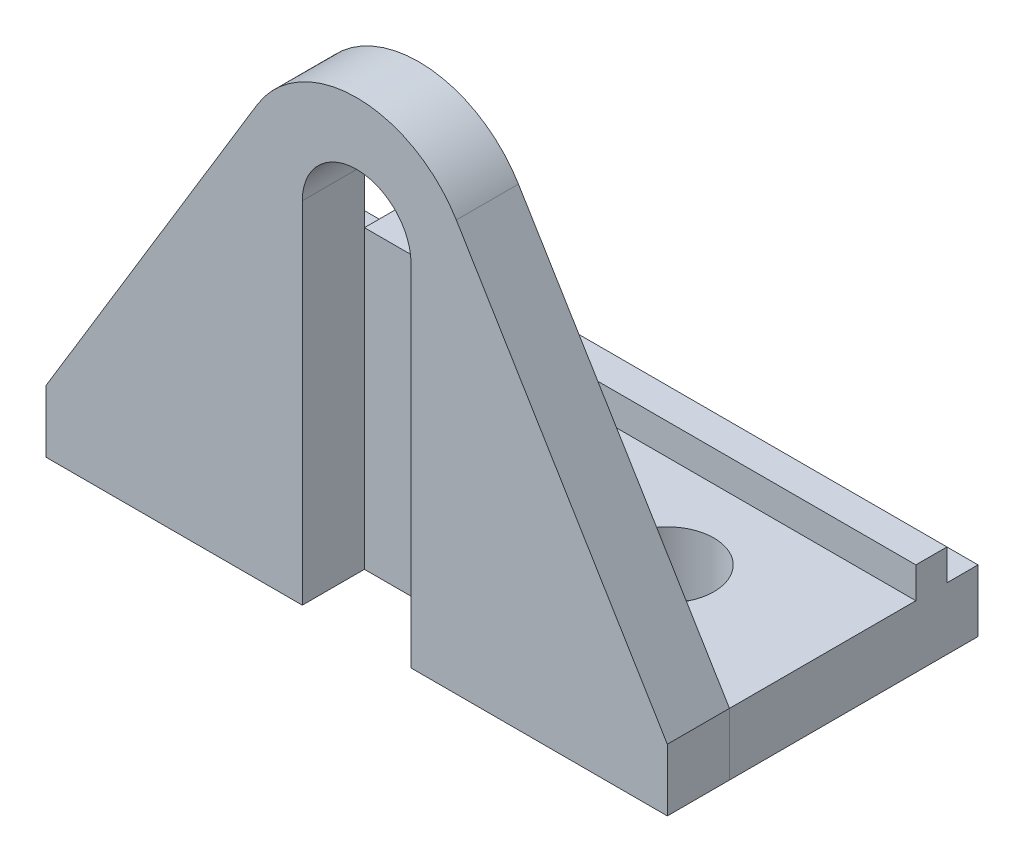
ISO-10303-21;
HEADER;
FILE_DESCRIPTION(('STEP AP214'),'2;1');
FILE_NAME('part.step','',(''),(''),'','','');
FILE_SCHEMA(('AUTOMOTIVE_DESIGN { 1 0 10303 214 1 1 1 1 }'));
ENDSEC;
DATA;
#1=APPLICATION_CONTEXT('core data for automotive mechanical design processes');
#2=APPLICATION_PROTOCOL_DEFINITION('international standard','automotive_design',2000,#1);
#3=PRODUCT_CONTEXT('',#1,'mechanical');
#4=PRODUCT('Part','Part','',(#3));
#5=PRODUCT_RELATED_PRODUCT_CATEGORY('part','',(#4));
#6=PRODUCT_DEFINITION_FORMATION('','',#4);
#7=PRODUCT_DEFINITION_CONTEXT('part definition',#1,'design');
#8=PRODUCT_DEFINITION('design','',#6,#7);
#9=PRODUCT_DEFINITION_SHAPE('','',#8);
#10=(LENGTH_UNIT() NAMED_UNIT(*) SI_UNIT(.MILLI.,.METRE.));
#11=(NAMED_UNIT(*) PLANE_ANGLE_UNIT() SI_UNIT($,.RADIAN.));
#12=(NAMED_UNIT(*) SI_UNIT($,.STERADIAN.) SOLID_ANGLE_UNIT());
#13=UNCERTAINTY_MEASURE_WITH_UNIT(LENGTH_MEASURE(1.E-05),#10,'distance_accuracy_value','');
#14=(GEOMETRIC_REPRESENTATION_CONTEXT(3) GLOBAL_UNCERTAINTY_ASSIGNED_CONTEXT((#13)) GLOBAL_UNIT_ASSIGNED_CONTEXT((#10,
#11,#12)) REPRESENTATION_CONTEXT('',''));
#15=CARTESIAN_POINT('',(0.,0.,0.));
#16=DIRECTION('',(0.,0.,1.));
#17=DIRECTION('',(1.,0.,0.));
#18=AXIS2_PLACEMENT_3D('',#15,#16,#17);
#19=CARTESIAN_POINT('',(2.47320292132228,0.999999999999996,-2.));
#20=DIRECTION('',(0.,-1.,0.));
#21=DIRECTION('',(1.,0.,0.));
#22=AXIS2_PLACEMENT_3D('',#19,#20,#21);
#23=PLANE('',#22);
#24=CARTESIAN_POINT('',(-4.27679707867771,0.999999999999995,-3.));
#25=DIRECTION('',(0.,1.,0.));
#26=DIRECTION('',(0.,0.,1.));
#27=AXIS2_PLACEMENT_3D('',#24,#25,#26);
#28=CIRCLE('',#27,1.5);
#29=CARTESIAN_POINT('',(-4.27679707867771,0.999999999999995,-1.5));
#30=VERTEX_POINT('',#29);
#31=EDGE_CURVE('E308',#30,#30,#28,.T.);
#32=ORIENTED_EDGE('',*,*,#31,.F.);
#33=EDGE_LOOP('',(#32));
#34=FACE_BOUND('',#33,.T.);
#35=CARTESIAN_POINT('',(5.72320292132229,0.999999999999995,-3.));
#36=DIRECTION('',(0.,1.,0.));
#37=DIRECTION('',(0.,0.,1.));
#38=AXIS2_PLACEMENT_3D('',#35,#36,#37);
#39=CIRCLE('',#38,1.5);
#40=CARTESIAN_POINT('',(5.72320292132229,0.999999999999995,-1.5));
#41=VERTEX_POINT('',#40);
#42=EDGE_CURVE('E302',#41,#41,#39,.T.);
#43=ORIENTED_EDGE('',*,*,#42,.F.);
#44=EDGE_LOOP('',(#43));
#45=FACE_BOUND('',#44,.T.);
#46=DIRECTION('',(1.,0.,0.));
#47=VECTOR('',#46,1.);
#48=CARTESIAN_POINT('',(-9.27679707867771,0.999999999999995,-6.));
#49=LINE('',#48,#47);
#50=CARTESIAN_POINT('',(-9.27679707867771,0.999999999999997,-6.));
#51=VERTEX_POINT('',#50);
#52=CARTESIAN_POINT('',(10.7232029213223,1.,-6.));
#53=VERTEX_POINT('',#52);
#54=EDGE_CURVE('E63',#51,#53,#49,.T.);
#55=ORIENTED_EDGE('',*,*,#54,.F.);
#56=DIRECTION('',(0.,0.,1.));
#57=VECTOR('',#56,1.);
#58=CARTESIAN_POINT('',(-9.27679707867771,0.999999999999997,-2.));
#59=LINE('',#58,#57);
#60=CARTESIAN_POINT('',(-9.27679707867771,0.999999999999997,0.));
#61=VERTEX_POINT('',#60);
#62=EDGE_CURVE('E158',#51,#61,#59,.T.);
#63=ORIENTED_EDGE('',*,*,#62,.T.);
#64=DIRECTION('',(1.,0.,0.));
#65=VECTOR('',#64,1.);
#66=CARTESIAN_POINT('',(-9.27679707867771,0.999999999999997,0.));
#67=LINE('',#66,#65);
#68=CARTESIAN_POINT('',(-1.02679707867772,0.999999999999996,0.));
#69=VERTEX_POINT('',#68);
#70=EDGE_CURVE('E187',#61,#69,#67,.T.);
#71=ORIENTED_EDGE('',*,*,#70,.T.);
#72=DIRECTION('',(0.,0.,1.));
#73=VECTOR('',#72,1.);
#74=CARTESIAN_POINT('',(-1.02679707867772,0.999999999999996,-2.));
#75=LINE('',#74,#73);
#76=CARTESIAN_POINT('',(-1.02679707867772,0.999999999999996,-2.));
#77=VERTEX_POINT('',#76);
#78=EDGE_CURVE('E207',#77,#69,#75,.T.);
#79=ORIENTED_EDGE('',*,*,#78,.F.);
#80=DIRECTION('',(1.,0.,0.));
#81=VECTOR('',#80,1.);
#82=CARTESIAN_POINT('',(10.7232029213223,1.,-2.));
#83=LINE('',#82,#81);
#84=CARTESIAN_POINT('',(2.47320292132228,0.999999999999996,-2.));
#85=VERTEX_POINT('',#84);
#86=EDGE_CURVE('E12',#77,#85,#83,.T.);
#87=ORIENTED_EDGE('',*,*,#86,.T.);
#88=DIRECTION('',(0.,0.,1.));
#89=VECTOR('',#88,1.);
#90=CARTESIAN_POINT('',(2.47320292132228,0.999999999999996,-2.));
#91=LINE('',#90,#89);
#92=CARTESIAN_POINT('',(2.47320292132228,0.999999999999996,0.));
#93=VERTEX_POINT('',#92);
#94=EDGE_CURVE('E200',#85,#93,#91,.T.);
#95=ORIENTED_EDGE('',*,*,#94,.T.);
#96=DIRECTION('',(1.,0.,0.));
#97=VECTOR('',#96,1.);
#98=CARTESIAN_POINT('',(2.47320292132228,0.999999999999996,0.));
#99=LINE('',#98,#97);
#100=CARTESIAN_POINT('',(10.7232029213223,1.,0.));
#101=VERTEX_POINT('',#100);
#102=EDGE_CURVE('E195',#93,#101,#99,.T.);
#103=ORIENTED_EDGE('',*,*,#102,.T.);
#104=DIRECTION('',(0.,0.,1.));
#105=VECTOR('',#104,1.);
#106=CARTESIAN_POINT('',(10.7232029213223,1.,-2.));
#107=LINE('',#106,#105);
#108=EDGE_CURVE('E68',#53,#101,#107,.T.);
#109=ORIENTED_EDGE('',*,*,#108,.F.);
#110=EDGE_LOOP('',(#55,#63,#71,#79,#87,#95,#103,#109));
#111=FACE_BOUND('',#110,.T.);
#112=ADVANCED_FACE('F46',(#34,#45,#111),#23,.F.);
#113=DIRECTION('',(-1.,0.,0.));
#114=VECTOR('',#113,1.);
#115=CARTESIAN_POINT('',(-9.27679707867771,0.999999999999995,-7.));
#116=LINE('',#115,#114);
#117=CARTESIAN_POINT('',(10.7232029213223,1.,-7.));
#118=VERTEX_POINT('',#117);
#119=CARTESIAN_POINT('',(-9.27679707867771,0.999999999999995,-7.));
#120=VERTEX_POINT('',#119);
#121=EDGE_CURVE('E154',#118,#120,#116,.T.);
#122=ORIENTED_EDGE('',*,*,#121,.F.);
#123=CARTESIAN_POINT('',(10.7232029213223,1.,-8.));
#124=VERTEX_POINT('',#123);
#125=EDGE_CURVE('E197',#124,#118,#107,.T.);
#126=ORIENTED_EDGE('',*,*,#125,.F.);
#127=DIRECTION('',(1.,0.,0.));
#128=VECTOR('',#127,1.);
#129=CARTESIAN_POINT('',(10.7232029213223,1.,-8.));
#130=LINE('',#129,#128);
#131=CARTESIAN_POINT('',(-9.27679707867771,1.,-8.));
#132=VERTEX_POINT('',#131);
#133=EDGE_CURVE('E173',#132,#124,#130,.T.);
#134=ORIENTED_EDGE('',*,*,#133,.F.);
#135=EDGE_CURVE('E208',#132,#120,#59,.T.);
#136=ORIENTED_EDGE('',*,*,#135,.T.);
#137=EDGE_LOOP('',(#122,#126,#134,#136));
#138=FACE_BOUND('',#137,.T.);
#139=ADVANCED_FACE('F271',(#138),#23,.F.);
#140=CARTESIAN_POINT('',(10.7232029213223,1.,-2.));
#141=DIRECTION('',(-1.,0.,0.));
#142=DIRECTION('',(0.,0.,1.));
#143=AXIS2_PLACEMENT_3D('',#140,#141,#142);
#144=PLANE('',#143);
#145=DIRECTION('',(0.,-1.,0.));
#146=VECTOR('',#145,1.);
#147=CARTESIAN_POINT('',(10.7232029213223,1.,0.));
#148=LINE('',#147,#146);
#149=CARTESIAN_POINT('',(10.7232029213223,-1.,0.));
#150=VERTEX_POINT('',#149);
#151=EDGE_CURVE('E176',#101,#150,#148,.T.);
#152=ORIENTED_EDGE('',*,*,#151,.T.);
#153=DIRECTION('',(0.,0.,1.));
#154=VECTOR('',#153,1.);
#155=CARTESIAN_POINT('',(10.7232029213223,-1.,-2.));
#156=LINE('',#155,#154);
#157=CARTESIAN_POINT('',(10.7232029213223,-1.,-8.));
#158=VERTEX_POINT('',#157);
#159=EDGE_CURVE('E55',#158,#150,#156,.T.);
#160=ORIENTED_EDGE('',*,*,#159,.F.);
#161=DIRECTION('',(0.,-1.,0.));
#162=VECTOR('',#161,1.);
#163=CARTESIAN_POINT('',(10.7232029213223,1.,-8.));
#164=LINE('',#163,#162);
#165=EDGE_CURVE('E159',#124,#158,#164,.T.);
#166=ORIENTED_EDGE('',*,*,#165,.F.);
#167=ORIENTED_EDGE('',*,*,#125,.T.);
#168=DIRECTION('',(0.,-1.,0.));
#169=VECTOR('',#168,1.);
#170=CARTESIAN_POINT('',(10.7232029213223,1.99999999999999,-7.));
#171=LINE('',#170,#169);
#172=CARTESIAN_POINT('',(10.7232029213223,1.99999999999999,-7.));
#173=VERTEX_POINT('',#172);
#174=EDGE_CURVE('E164',#173,#118,#171,.T.);
#175=ORIENTED_EDGE('',*,*,#174,.F.);
#176=DIRECTION('',(0.,0.,-1.));
#177=VECTOR('',#176,1.);
#178=CARTESIAN_POINT('',(10.7232029213223,1.99999999999999,-7.));
#179=LINE('',#178,#177);
#180=CARTESIAN_POINT('',(10.7232029213223,1.99999999999999,-6.));
#181=VERTEX_POINT('',#180);
#182=EDGE_CURVE('E144',#181,#173,#179,.T.);
#183=ORIENTED_EDGE('',*,*,#182,.F.);
#184=DIRECTION('',(0.,-1.,0.));
#185=VECTOR('',#184,1.);
#186=CARTESIAN_POINT('',(10.7232029213223,1.99999999999999,-6.));
#187=LINE('',#186,#185);
#188=EDGE_CURVE('E141',#181,#53,#187,.T.);
#189=ORIENTED_EDGE('',*,*,#188,.T.);
#190=ORIENTED_EDGE('',*,*,#108,.T.);
#191=EDGE_LOOP('',(#152,#160,#166,#167,#175,#183,#189,#190));
#192=FACE_BOUND('',#191,.T.);
#193=ADVANCED_FACE('F48',(#192),#144,.F.);
#194=CARTESIAN_POINT('',(10.7232029213223,-1.,-2.));
#195=DIRECTION('',(0.,1.,0.));
#196=DIRECTION('',(0.,0.,1.));
#197=AXIS2_PLACEMENT_3D('',#194,#195,#196);
#198=PLANE('',#197);
#199=CARTESIAN_POINT('',(-4.27679707867771,-1.,-3.));
#200=DIRECTION('',(0.,1.,0.));
#201=DIRECTION('',(0.,0.,1.));
#202=AXIS2_PLACEMENT_3D('',#199,#200,#201);
#203=CIRCLE('',#202,1.5);
#204=CARTESIAN_POINT('',(-4.27679707867771,-1.,-1.5));
#205=VERTEX_POINT('',#204);
#206=EDGE_CURVE('E297',#205,#205,#203,.F.);
#207=ORIENTED_EDGE('',*,*,#206,.F.);
#208=EDGE_LOOP('',(#207));
#209=FACE_BOUND('',#208,.T.);
#210=CARTESIAN_POINT('',(5.72320292132229,-1.,-3.));
#211=DIRECTION('',(0.,1.,0.));
#212=DIRECTION('',(0.,0.,1.));
#213=AXIS2_PLACEMENT_3D('',#210,#211,#212);
#214=CIRCLE('',#213,1.5);
#215=CARTESIAN_POINT('',(5.72320292132229,-1.,-1.5));
#216=VERTEX_POINT('',#215);
#217=EDGE_CURVE('E261',#216,#216,#214,.F.);
#218=ORIENTED_EDGE('',*,*,#217,.F.);
#219=EDGE_LOOP('',(#218));
#220=FACE_BOUND('',#219,.T.);
#221=DIRECTION('',(-1.,0.,0.));
#222=VECTOR('',#221,1.);
#223=CARTESIAN_POINT('',(10.7232029213223,-1.,0.));
#224=LINE('',#223,#222);
#225=CARTESIAN_POINT('',(-9.27679707867771,-1.,0.));
#226=VERTEX_POINT('',#225);
#227=EDGE_CURVE('E183',#150,#226,#224,.T.);
#228=ORIENTED_EDGE('',*,*,#227,.T.);
#229=DIRECTION('',(0.,0.,1.));
#230=VECTOR('',#229,1.);
#231=CARTESIAN_POINT('',(-9.27679707867771,-1.,-2.));
#232=LINE('',#231,#230);
#233=CARTESIAN_POINT('',(-9.27679707867771,-1.,-8.));
#234=VERTEX_POINT('',#233);
#235=EDGE_CURVE('E210',#234,#226,#232,.T.);
#236=ORIENTED_EDGE('',*,*,#235,.F.);
#237=DIRECTION('',(-1.,0.,0.));
#238=VECTOR('',#237,1.);
#239=CARTESIAN_POINT('',(10.7232029213223,-1.,-8.));
#240=LINE('',#239,#238);
#241=EDGE_CURVE('E162',#158,#234,#240,.T.);
#242=ORIENTED_EDGE('',*,*,#241,.F.);
#243=ORIENTED_EDGE('',*,*,#159,.T.);
#244=EDGE_LOOP('',(#228,#236,#242,#243));
#245=FACE_BOUND('',#244,.T.);
#246=ADVANCED_FACE('F278',(#209,#220,#245),#198,.F.);
#247=CARTESIAN_POINT('',(-9.27679707867771,-1.,-2.));
#248=DIRECTION('',(1.,0.,0.));
#249=DIRECTION('',(0.,0.,-1.));
#250=AXIS2_PLACEMENT_3D('',#247,#248,#249);
#251=PLANE('',#250);
#252=DIRECTION('',(0.,1.,0.));
#253=VECTOR('',#252,1.);
#254=CARTESIAN_POINT('',(-9.27679707867771,-1.,0.));
#255=LINE('',#254,#253);
#256=EDGE_CURVE('E185',#226,#61,#255,.T.);
#257=ORIENTED_EDGE('',*,*,#256,.T.);
#258=ORIENTED_EDGE('',*,*,#62,.F.);
#259=DIRECTION('',(0.,-1.,0.));
#260=VECTOR('',#259,1.);
#261=CARTESIAN_POINT('',(-9.27679707867771,1.99999999999999,-6.));
#262=LINE('',#261,#260);
#263=CARTESIAN_POINT('',(-9.27679707867771,1.99999999999999,-6.));
#264=VERTEX_POINT('',#263);
#265=EDGE_CURVE('E139',#264,#51,#262,.T.);
#266=ORIENTED_EDGE('',*,*,#265,.F.);
#267=DIRECTION('',(0.,0.,1.));
#268=VECTOR('',#267,1.);
#269=CARTESIAN_POINT('',(-9.27679707867771,1.99999999999999,-7.));
#270=LINE('',#269,#268);
#271=CARTESIAN_POINT('',(-9.27679707867771,1.99999999999999,-7.));
#272=VERTEX_POINT('',#271);
#273=EDGE_CURVE('E145',#272,#264,#270,.T.);
#274=ORIENTED_EDGE('',*,*,#273,.F.);
#275=DIRECTION('',(0.,-1.,0.));
#276=VECTOR('',#275,1.);
#277=CARTESIAN_POINT('',(-9.27679707867771,1.99999999999999,-7.));
#278=LINE('',#277,#276);
#279=EDGE_CURVE('E257',#272,#120,#278,.T.);
#280=ORIENTED_EDGE('',*,*,#279,.T.);
#281=ORIENTED_EDGE('',*,*,#135,.F.);
#282=DIRECTION('',(0.,1.,0.));
#283=VECTOR('',#282,1.);
#284=CARTESIAN_POINT('',(-9.27679707867771,1.,-8.));
#285=LINE('',#284,#283);
#286=EDGE_CURVE('E170',#234,#132,#285,.T.);
#287=ORIENTED_EDGE('',*,*,#286,.F.);
#288=ORIENTED_EDGE('',*,*,#235,.T.);
#289=EDGE_LOOP('',(#257,#258,#266,#274,#280,#281,#287,#288));
#290=FACE_BOUND('',#289,.T.);
#291=ADVANCED_FACE('F157',(#290),#251,.F.);
#292=CARTESIAN_POINT('',(-1.02679707867772,0.999999999999996,-2.));
#293=DIRECTION('',(1.,0.,0.));
#294=DIRECTION('',(0.,1.,0.));
#295=AXIS2_PLACEMENT_3D('',#292,#293,#294);
#296=PLANE('',#295);
#297=DIRECTION('',(0.,1.,0.));
#298=VECTOR('',#297,1.);
#299=CARTESIAN_POINT('',(-1.02679707867772,0.999999999999996,0.));
#300=LINE('',#299,#298);
#301=CARTESIAN_POINT('',(-1.02679707867771,8.525,0.));
#302=VERTEX_POINT('',#301);
#303=EDGE_CURVE('E189',#69,#302,#300,.T.);
#304=ORIENTED_EDGE('',*,*,#303,.T.);
#305=DIRECTION('',(0.,0.,1.));
#306=VECTOR('',#305,1.);
#307=CARTESIAN_POINT('',(-1.02679707867771,8.525,-2.));
#308=LINE('',#307,#306);
#309=CARTESIAN_POINT('',(-1.02679707867771,8.525,-2.));
#310=VERTEX_POINT('',#309);
#311=EDGE_CURVE('E204',#310,#302,#308,.T.);
#312=ORIENTED_EDGE('',*,*,#311,.F.);
#313=DIRECTION('',(0.,1.,0.));
#314=VECTOR('',#313,1.);
#315=CARTESIAN_POINT('',(-1.02679707867772,0.999999999999996,-2.));
#316=LINE('',#315,#314);
#317=EDGE_CURVE('E180',#77,#310,#316,.T.);
#318=ORIENTED_EDGE('',*,*,#317,.F.);
#319=ORIENTED_EDGE('',*,*,#78,.T.);
#320=EDGE_LOOP('',(#304,#312,#318,#319));
#321=FACE_BOUND('',#320,.T.);
#322=ADVANCED_FACE('F235',(#321),#296,.F.);
#323=CARTESIAN_POINT('',(2.47320292132228,8.525,-2.));
#324=DIRECTION('',(0.,-1.,0.));
#325=DIRECTION('',(0.,0.,-1.));
#326=AXIS2_PLACEMENT_3D('',#323,#324,#325);
#327=PLANE('',#326);
#328=DIRECTION('',(1.,0.,0.));
#329=VECTOR('',#328,1.);
#330=CARTESIAN_POINT('',(2.47320292132228,8.525,0.));
#331=LINE('',#330,#329);
#332=CARTESIAN_POINT('',(2.47320292132228,8.525,0.));
#333=VERTEX_POINT('',#332);
#334=EDGE_CURVE('E191',#302,#333,#331,.T.);
#335=ORIENTED_EDGE('',*,*,#334,.T.);
#336=DIRECTION('',(0.,0.,1.));
#337=VECTOR('',#336,1.);
#338=CARTESIAN_POINT('',(2.47320292132228,8.525,-2.));
#339=LINE('',#338,#337);
#340=CARTESIAN_POINT('',(2.47320292132228,8.525,-2.));
#341=VERTEX_POINT('',#340);
#342=EDGE_CURVE('E201',#341,#333,#339,.T.);
#343=ORIENTED_EDGE('',*,*,#342,.F.);
#344=DIRECTION('',(1.,0.,0.));
#345=VECTOR('',#344,1.);
#346=CARTESIAN_POINT('',(2.47320292132228,8.525,-2.));
#347=LINE('',#346,#345);
#348=EDGE_CURVE('E177',#310,#341,#347,.T.);
#349=ORIENTED_EDGE('',*,*,#348,.F.);
#350=ORIENTED_EDGE('',*,*,#311,.T.);
#351=EDGE_LOOP('',(#335,#343,#349,#350));
#352=FACE_BOUND('',#351,.T.);
#353=ADVANCED_FACE('F239',(#352),#327,.F.);
#354=CARTESIAN_POINT('',(2.47320292132228,0.999999999999996,-2.));
#355=DIRECTION('',(-1.,0.,0.));
#356=DIRECTION('',(0.,0.,1.));
#357=AXIS2_PLACEMENT_3D('',#354,#355,#356);
#358=PLANE('',#357);
#359=DIRECTION('',(0.,-1.,0.));
#360=VECTOR('',#359,1.);
#361=CARTESIAN_POINT('',(2.47320292132228,0.999999999999996,0.));
#362=LINE('',#361,#360);
#363=EDGE_CURVE('E193',#333,#93,#362,.T.);
#364=ORIENTED_EDGE('',*,*,#363,.T.);
#365=ORIENTED_EDGE('',*,*,#94,.F.);
#366=DIRECTION('',(0.,-1.,0.));
#367=VECTOR('',#366,1.);
#368=CARTESIAN_POINT('',(2.47320292132228,0.999999999999996,-2.));
#369=LINE('',#368,#367);
#370=EDGE_CURVE('E179',#341,#85,#369,.T.);
#371=ORIENTED_EDGE('',*,*,#370,.F.);
#372=ORIENTED_EDGE('',*,*,#342,.T.);
#373=EDGE_LOOP('',(#364,#365,#371,#372));
#374=FACE_BOUND('',#373,.T.);
#375=ADVANCED_FACE('F244',(#374),#358,.F.);
#376=CARTESIAN_POINT('',(0.,0.,-2.));
#377=DIRECTION('',(0.,0.,-1.));
#378=DIRECTION('',(-1.,0.,0.));
#379=AXIS2_PLACEMENT_3D('',#376,#377,#378);
#380=PLANE('',#379);
#381=ORIENTED_EDGE('',*,*,#86,.F.);
#382=ORIENTED_EDGE('',*,*,#317,.T.);
#383=ORIENTED_EDGE('',*,*,#348,.T.);
#384=ORIENTED_EDGE('',*,*,#370,.T.);
#385=EDGE_LOOP('',(#381,#382,#383,#384));
#386=FACE_BOUND('',#385,.T.);
#387=ADVANCED_FACE('F230',(#386),#380,.T.);
#388=CARTESIAN_POINT('',(0.,0.,0.));
#389=DIRECTION('',(0.,0.,-1.));
#390=DIRECTION('',(-1.,0.,0.));
#391=AXIS2_PLACEMENT_3D('',#388,#389,#390);
#392=PLANE('',#391);
#393=ORIENTED_EDGE('',*,*,#151,.F.);
#394=ORIENTED_EDGE('',*,*,#102,.F.);
#395=ORIENTED_EDGE('',*,*,#363,.F.);
#396=ORIENTED_EDGE('',*,*,#334,.F.);
#397=ORIENTED_EDGE('',*,*,#303,.F.);
#398=ORIENTED_EDGE('',*,*,#70,.F.);
#399=ORIENTED_EDGE('',*,*,#256,.F.);
#400=ORIENTED_EDGE('',*,*,#227,.F.);
#401=EDGE_LOOP('',(#393,#394,#395,#396,#397,#398,#399,#400));
#402=FACE_BOUND('',#401,.T.);
#403=ADVANCED_FACE('F249',(#402),#392,.F.);
#404=CARTESIAN_POINT('',(0.,0.,-8.));
#405=DIRECTION('',(0.,0.,-1.));
#406=DIRECTION('',(-1.,0.,0.));
#407=AXIS2_PLACEMENT_3D('',#404,#405,#406);
#408=PLANE('',#407);
#409=ORIENTED_EDGE('',*,*,#165,.T.);
#410=ORIENTED_EDGE('',*,*,#241,.T.);
#411=ORIENTED_EDGE('',*,*,#286,.T.);
#412=ORIENTED_EDGE('',*,*,#133,.T.);
#413=EDGE_LOOP('',(#409,#410,#411,#412));
#414=FACE_BOUND('',#413,.T.);
#415=ADVANCED_FACE('F270',(#414),#408,.T.);
#416=CARTESIAN_POINT('',(-9.27679707867771,1.99999999999999,-6.));
#417=DIRECTION('',(0.,0.,-1.));
#418=DIRECTION('',(-1.,0.,0.));
#419=AXIS2_PLACEMENT_3D('',#416,#417,#418);
#420=PLANE('',#419);
#421=ORIENTED_EDGE('',*,*,#54,.T.);
#422=ORIENTED_EDGE('',*,*,#188,.F.);
#423=DIRECTION('',(1.,0.,0.));
#424=VECTOR('',#423,1.);
#425=CARTESIAN_POINT('',(-9.27679707867771,1.99999999999999,-6.));
#426=LINE('',#425,#424);
#427=EDGE_CURVE('E135',#264,#181,#426,.T.);
#428=ORIENTED_EDGE('',*,*,#427,.F.);
#429=ORIENTED_EDGE('',*,*,#265,.T.);
#430=EDGE_LOOP('',(#421,#422,#428,#429));
#431=FACE_BOUND('',#430,.T.);
#432=ADVANCED_FACE('F137',(#431),#420,.F.);
#433=CARTESIAN_POINT('',(-9.27679707867771,1.99999999999999,-7.));
#434=DIRECTION('',(0.,0.,1.));
#435=DIRECTION('',(1.,0.,0.));
#436=AXIS2_PLACEMENT_3D('',#433,#434,#435);
#437=PLANE('',#436);
#438=ORIENTED_EDGE('',*,*,#121,.T.);
#439=ORIENTED_EDGE('',*,*,#279,.F.);
#440=DIRECTION('',(-1.,0.,0.));
#441=VECTOR('',#440,1.);
#442=CARTESIAN_POINT('',(-9.27679707867771,1.99999999999999,-7.));
#443=LINE('',#442,#441);
#444=EDGE_CURVE('E150',#173,#272,#443,.T.);
#445=ORIENTED_EDGE('',*,*,#444,.F.);
#446=ORIENTED_EDGE('',*,*,#174,.T.);
#447=EDGE_LOOP('',(#438,#439,#445,#446));
#448=FACE_BOUND('',#447,.T.);
#449=ADVANCED_FACE('F265',(#448),#437,.F.);
#450=CARTESIAN_POINT('',(0.,1.99999999999999,0.));
#451=DIRECTION('',(0.,1.,0.));
#452=DIRECTION('',(0.,0.,1.));
#453=AXIS2_PLACEMENT_3D('',#450,#451,#452);
#454=PLANE('',#453);
#455=ORIENTED_EDGE('',*,*,#273,.T.);
#456=ORIENTED_EDGE('',*,*,#427,.T.);
#457=ORIENTED_EDGE('',*,*,#182,.T.);
#458=ORIENTED_EDGE('',*,*,#444,.T.);
#459=EDGE_LOOP('',(#455,#456,#457,#458));
#460=FACE_BOUND('',#459,.T.);
#461=ADVANCED_FACE('F148',(#460),#454,.T.);
#462=CARTESIAN_POINT('',(5.72320292132229,-5.24264068711929,-3.));
#463=DIRECTION('',(0.,1.,0.));
#464=DIRECTION('',(0.,0.,1.));
#465=AXIS2_PLACEMENT_3D('',#462,#463,#464);
#466=CYLINDRICAL_SURFACE('',#465,1.5);
#467=ORIENTED_EDGE('',*,*,#217,.T.);
#468=EDGE_LOOP('',(#467));
#469=FACE_BOUND('',#468,.T.);
#470=ORIENTED_EDGE('',*,*,#42,.T.);
#471=EDGE_LOOP('',(#470));
#472=FACE_BOUND('',#471,.T.);
#473=ADVANCED_FACE('F316',(#469,#472),#466,.F.);
#474=CARTESIAN_POINT('',(-4.27679707867771,-5.24264068711929,-3.));
#475=DIRECTION('',(0.,1.,0.));
#476=DIRECTION('',(0.,0.,1.));
#477=AXIS2_PLACEMENT_3D('',#474,#475,#476);
#478=CYLINDRICAL_SURFACE('',#477,1.5);
#479=ORIENTED_EDGE('',*,*,#206,.T.);
#480=EDGE_LOOP('',(#479));
#481=FACE_BOUND('',#480,.T.);
#482=ORIENTED_EDGE('',*,*,#31,.T.);
#483=EDGE_LOOP('',(#482));
#484=FACE_BOUND('',#483,.T.);
#485=ADVANCED_FACE('F312',(#481,#484),#478,.F.);
#486=CLOSED_SHELL('',(#112,#139,#193,#246,#291,#322,#353,#375,#387,#403,#415,#432,#449,#461,
#473,#485));
#487=MANIFOLD_SOLID_BREP('B2',#486);
#488=CARTESIAN_POINT('',(8.28953520219033,5.0192891286328,2.));
#489=DIRECTION('',(-0.855411436851854,-0.517949103390524,0.));
#490=DIRECTION('',(0.517949103390524,-0.855411436851854,0.));
#491=AXIS2_PLACEMENT_3D('',#488,#489,#490);
#492=PLANE('',#491);
#493=DIRECTION('',(-0.517949103390524,0.855411436851853,0.));
#494=VECTOR('',#493,1.);
#495=CARTESIAN_POINT('',(8.28953520219033,5.0192891286328,0.));
#496=LINE('',#495,#494);
#497=CARTESIAN_POINT('',(10.7232029213223,1.,0.));
#498=VERTEX_POINT('',#497);
#499=CARTESIAN_POINT('',(3.93099580951673,12.2175725507999,0.));
#500=VERTEX_POINT('',#499);
#501=EDGE_CURVE('E607',#498,#500,#496,.T.);
#502=ORIENTED_EDGE('',*,*,#501,.T.);
#503=DIRECTION('',(0.,0.,-1.));
#504=VECTOR('',#503,1.);
#505=CARTESIAN_POINT('',(3.93099580951673,12.2175725507999,2.));
#506=LINE('',#505,#504);
#507=CARTESIAN_POINT('',(3.93099580951673,12.2175725507999,2.));
#508=VERTEX_POINT('',#507);
#509=EDGE_CURVE('E44',#508,#500,#506,.T.);
#510=ORIENTED_EDGE('',*,*,#509,.F.);
#511=DIRECTION('',(-0.517949103390524,0.855411436851853,0.));
#512=VECTOR('',#511,1.);
#513=CARTESIAN_POINT('',(8.28953520219033,5.0192891286328,2.));
#514=LINE('',#513,#512);
#515=CARTESIAN_POINT('',(10.7232029213223,1.,2.));
#516=VERTEX_POINT('',#515);
#517=EDGE_CURVE('E576',#516,#508,#514,.T.);
#518=ORIENTED_EDGE('',*,*,#517,.F.);
#519=DIRECTION('',(0.,0.,-1.));
#520=VECTOR('',#519,1.);
#521=CARTESIAN_POINT('',(10.7232029213223,1.,2.));
#522=LINE('',#521,#520);
#523=EDGE_CURVE('E469',#516,#498,#522,.T.);
#524=ORIENTED_EDGE('',*,*,#523,.T.);
#525=EDGE_LOOP('',(#502,#510,#518,#524));
#526=FACE_BOUND('',#525,.T.);
#527=ADVANCED_FACE('F453',(#526),#492,.F.);
#528=CARTESIAN_POINT('',(0.723202921322285,10.2752634130854,2.));
#529=DIRECTION('',(0.,0.,-1.));
#530=DIRECTION('',(-1.,0.,0.));
#531=AXIS2_PLACEMENT_3D('',#528,#529,#530);
#532=CYLINDRICAL_SURFACE('',#531,3.75);
#533=CARTESIAN_POINT('',(0.723202921322285,10.2752634130854,0.));
#534=DIRECTION('',(0.,0.,1.));
#535=DIRECTION('',(1.,0.,0.));
#536=AXIS2_PLACEMENT_3D('',#533,#534,#535);
#537=CIRCLE('',#536,3.75);
#538=CARTESIAN_POINT('',(-2.48458996687216,12.2175725507999,0.));
#539=VERTEX_POINT('',#538);
#540=EDGE_CURVE('E605',#500,#539,#537,.T.);
#541=ORIENTED_EDGE('',*,*,#540,.T.);
#542=DIRECTION('',(0.,0.,-1.));
#543=VECTOR('',#542,1.);
#544=CARTESIAN_POINT('',(-2.48458996687216,12.2175725507999,2.));
#545=LINE('',#544,#543);
#546=CARTESIAN_POINT('',(-2.48458996687216,12.2175725507999,2.));
#547=VERTEX_POINT('',#546);
#548=EDGE_CURVE('E461',#547,#539,#545,.T.);
#549=ORIENTED_EDGE('',*,*,#548,.F.);
#550=CARTESIAN_POINT('',(0.723202921322285,10.2752634130854,2.));
#551=DIRECTION('',(0.,0.,1.));
#552=DIRECTION('',(1.,0.,0.));
#553=AXIS2_PLACEMENT_3D('',#550,#551,#552);
#554=CIRCLE('',#553,3.75);
#555=EDGE_CURVE('E514',#508,#547,#554,.T.);
#556=ORIENTED_EDGE('',*,*,#555,.F.);
#557=ORIENTED_EDGE('',*,*,#509,.T.);
#558=EDGE_LOOP('',(#541,#549,#556,#557));
#559=FACE_BOUND('',#558,.T.);
#560=ADVANCED_FACE('F606',(#559),#532,.T.);
#561=CARTESIAN_POINT('',(-7.23115849724355,4.37844515372164,2.));
#562=DIRECTION('',(-0.855411436851854,0.517949103390524,0.));
#563=DIRECTION('',(-0.517949103390524,-0.855411436851854,0.));
#564=AXIS2_PLACEMENT_3D('',#561,#562,#563);
#565=PLANE('',#564);
#566=DIRECTION('',(0.517949103390524,0.855411436851854,0.));
#567=VECTOR('',#566,1.);
#568=CARTESIAN_POINT('',(-7.23115849724355,4.37844515372164,0.));
#569=LINE('',#568,#567);
#570=CARTESIAN_POINT('',(-9.27679707867771,0.999999999999997,0.));
#571=VERTEX_POINT('',#570);
#572=EDGE_CURVE('E604',#571,#539,#569,.T.);
#573=ORIENTED_EDGE('',*,*,#572,.F.);
#574=DIRECTION('',(0.,0.,-1.));
#575=VECTOR('',#574,1.);
#576=CARTESIAN_POINT('',(-9.27679707867771,0.999999999999997,2.));
#577=LINE('',#576,#575);
#578=CARTESIAN_POINT('',(-9.27679707867771,0.999999999999997,2.));
#579=VERTEX_POINT('',#578);
#580=EDGE_CURVE('E598',#579,#571,#577,.T.);
#581=ORIENTED_EDGE('',*,*,#580,.F.);
#582=DIRECTION('',(0.517949103390524,0.855411436851854,0.));
#583=VECTOR('',#582,1.);
#584=CARTESIAN_POINT('',(-7.23115849724355,4.37844515372164,2.));
#585=LINE('',#584,#583);
#586=EDGE_CURVE('E568',#579,#547,#585,.T.);
#587=ORIENTED_EDGE('',*,*,#586,.T.);
#588=ORIENTED_EDGE('',*,*,#548,.T.);
#589=EDGE_LOOP('',(#573,#581,#587,#588));
#590=FACE_BOUND('',#589,.T.);
#591=ADVANCED_FACE('F602',(#590),#565,.T.);
#592=CARTESIAN_POINT('',(-9.27679707867771,0.,2.));
#593=DIRECTION('',(1.,0.,0.));
#594=DIRECTION('',(0.,0.,-1.));
#595=AXIS2_PLACEMENT_3D('',#592,#593,#594);
#596=PLANE('',#595);
#597=DIRECTION('',(0.,-1.,0.));
#598=VECTOR('',#597,1.);
#599=CARTESIAN_POINT('',(-9.27679707867771,0.,0.));
#600=LINE('',#599,#598);
#601=CARTESIAN_POINT('',(-9.27679707867771,-1.,0.));
#602=VERTEX_POINT('',#601);
#603=EDGE_CURVE('E612',#571,#602,#600,.T.);
#604=ORIENTED_EDGE('',*,*,#603,.T.);
#605=DIRECTION('',(0.,0.,-1.));
#606=VECTOR('',#605,1.);
#607=CARTESIAN_POINT('',(-9.27679707867771,-1.,2.));
#608=LINE('',#607,#606);
#609=CARTESIAN_POINT('',(-9.27679707867771,-1.,2.));
#610=VERTEX_POINT('',#609);
#611=EDGE_CURVE('E595',#610,#602,#608,.T.);
#612=ORIENTED_EDGE('',*,*,#611,.F.);
#613=DIRECTION('',(0.,-1.,0.));
#614=VECTOR('',#613,1.);
#615=CARTESIAN_POINT('',(-9.27679707867771,0.,2.));
#616=LINE('',#615,#614);
#617=EDGE_CURVE('E564',#579,#610,#616,.T.);
#618=ORIENTED_EDGE('',*,*,#617,.F.);
#619=ORIENTED_EDGE('',*,*,#580,.T.);
#620=EDGE_LOOP('',(#604,#612,#618,#619));
#621=FACE_BOUND('',#620,.T.);
#622=ADVANCED_FACE('F631',(#621),#596,.F.);
#623=CARTESIAN_POINT('',(0.,-1.,2.));
#624=DIRECTION('',(0.,1.,0.));
#625=DIRECTION('',(0.,0.,1.));
#626=AXIS2_PLACEMENT_3D('',#623,#624,#625);
#627=PLANE('',#626);
#628=DIRECTION('',(1.,0.,0.));
#629=VECTOR('',#628,1.);
#630=CARTESIAN_POINT('',(0.,-1.,0.));
#631=LINE('',#630,#629);
#632=CARTESIAN_POINT('',(-1.02679707867771,-1.,0.));
#633=VERTEX_POINT('',#632);
#634=EDGE_CURVE('E584',#602,#633,#631,.T.);
#635=ORIENTED_EDGE('',*,*,#634,.T.);
#636=DIRECTION('',(0.,0.,-1.));
#637=VECTOR('',#636,1.);
#638=CARTESIAN_POINT('',(-1.02679707867771,-1.,2.));
#639=LINE('',#638,#637);
#640=CARTESIAN_POINT('',(-1.02679707867771,-1.,2.));
#641=VERTEX_POINT('',#640);
#642=EDGE_CURVE('E593',#641,#633,#639,.T.);
#643=ORIENTED_EDGE('',*,*,#642,.F.);
#644=DIRECTION('',(1.,0.,0.));
#645=VECTOR('',#644,1.);
#646=CARTESIAN_POINT('',(0.,-1.,2.));
#647=LINE('',#646,#645);
#648=EDGE_CURVE('E559',#610,#641,#647,.T.);
#649=ORIENTED_EDGE('',*,*,#648,.F.);
#650=ORIENTED_EDGE('',*,*,#611,.T.);
#651=EDGE_LOOP('',(#635,#643,#649,#650));
#652=FACE_BOUND('',#651,.T.);
#653=ADVANCED_FACE('F629',(#652),#627,.F.);
#654=CARTESIAN_POINT('',(-1.02679707867771,0.,2.));
#655=DIRECTION('',(1.,0.,0.));
#656=DIRECTION('',(0.,1.,0.));
#657=AXIS2_PLACEMENT_3D('',#654,#655,#656);
#658=PLANE('',#657);
#659=DIRECTION('',(0.,-1.,0.));
#660=VECTOR('',#659,1.);
#661=CARTESIAN_POINT('',(-1.02679707867771,0.,0.));
#662=LINE('',#661,#660);
#663=CARTESIAN_POINT('',(-1.02679707867772,10.2752634130854,0.));
#664=VERTEX_POINT('',#663);
#665=EDGE_CURVE('E618',#664,#633,#662,.T.);
#666=ORIENTED_EDGE('',*,*,#665,.F.);
#667=DIRECTION('',(0.,0.,-1.));
#668=VECTOR('',#667,1.);
#669=CARTESIAN_POINT('',(-1.02679707867772,10.2752634130854,2.));
#670=LINE('',#669,#668);
#671=CARTESIAN_POINT('',(-1.02679707867772,10.2752634130854,2.));
#672=VERTEX_POINT('',#671);
#673=EDGE_CURVE('E591',#672,#664,#670,.T.);
#674=ORIENTED_EDGE('',*,*,#673,.F.);
#675=DIRECTION('',(0.,-1.,0.));
#676=VECTOR('',#675,1.);
#677=CARTESIAN_POINT('',(-1.02679707867771,0.,2.));
#678=LINE('',#677,#676);
#679=EDGE_CURVE('E563',#672,#641,#678,.T.);
#680=ORIENTED_EDGE('',*,*,#679,.T.);
#681=ORIENTED_EDGE('',*,*,#642,.T.);
#682=EDGE_LOOP('',(#666,#674,#680,#681));
#683=FACE_BOUND('',#682,.T.);
#684=ADVANCED_FACE('F627',(#683),#658,.T.);
#685=CARTESIAN_POINT('',(0.723202921322285,10.2752634130854,2.));
#686=DIRECTION('',(0.,0.,-1.));
#687=DIRECTION('',(-1.,0.,0.));
#688=AXIS2_PLACEMENT_3D('',#685,#686,#687);
#689=CYLINDRICAL_SURFACE('',#688,1.75);
#690=CARTESIAN_POINT('',(0.723202921322285,10.2752634130854,0.));
#691=DIRECTION('',(0.,0.,1.));
#692=DIRECTION('',(1.,0.,0.));
#693=AXIS2_PLACEMENT_3D('',#690,#691,#692);
#694=CIRCLE('',#693,1.75);
#695=CARTESIAN_POINT('',(2.47320292132229,10.2752634130854,0.));
#696=VERTEX_POINT('',#695);
#697=EDGE_CURVE('E620',#696,#664,#694,.T.);
#698=ORIENTED_EDGE('',*,*,#697,.F.);
#699=DIRECTION('',(0.,0.,-1.));
#700=VECTOR('',#699,1.);
#701=CARTESIAN_POINT('',(2.47320292132229,10.2752634130854,2.));
#702=LINE('',#701,#700);
#703=CARTESIAN_POINT('',(2.47320292132229,10.2752634130854,2.));
#704=VERTEX_POINT('',#703);
#705=EDGE_CURVE('E554',#704,#696,#702,.T.);
#706=ORIENTED_EDGE('',*,*,#705,.F.);
#707=CARTESIAN_POINT('',(0.723202921322285,10.2752634130854,2.));
#708=DIRECTION('',(0.,0.,1.));
#709=DIRECTION('',(1.,0.,0.));
#710=AXIS2_PLACEMENT_3D('',#707,#708,#709);
#711=CIRCLE('',#710,1.75);
#712=EDGE_CURVE('E544',#704,#672,#711,.T.);
#713=ORIENTED_EDGE('',*,*,#712,.T.);
#714=ORIENTED_EDGE('',*,*,#673,.T.);
#715=EDGE_LOOP('',(#698,#706,#713,#714));
#716=FACE_BOUND('',#715,.T.);
#717=ADVANCED_FACE('F625',(#716),#689,.F.);
#718=CARTESIAN_POINT('',(2.47320292132229,0.,2.));
#719=DIRECTION('',(1.,0.,0.));
#720=DIRECTION('',(0.,1.,0.));
#721=AXIS2_PLACEMENT_3D('',#718,#719,#720);
#722=PLANE('',#721);
#723=DIRECTION('',(0.,-1.,0.));
#724=VECTOR('',#723,1.);
#725=CARTESIAN_POINT('',(2.47320292132229,0.,0.));
#726=LINE('',#725,#724);
#727=CARTESIAN_POINT('',(2.47320292132229,-1.,0.));
#728=VERTEX_POINT('',#727);
#729=EDGE_CURVE('E551',#696,#728,#726,.T.);
#730=ORIENTED_EDGE('',*,*,#729,.T.);
#731=DIRECTION('',(0.,0.,-1.));
#732=VECTOR('',#731,1.);
#733=CARTESIAN_POINT('',(2.47320292132229,-1.,2.));
#734=LINE('',#733,#732);
#735=CARTESIAN_POINT('',(2.47320292132229,-1.,2.));
#736=VERTEX_POINT('',#735);
#737=EDGE_CURVE('E548',#736,#728,#734,.T.);
#738=ORIENTED_EDGE('',*,*,#737,.F.);
#739=DIRECTION('',(0.,-1.,0.));
#740=VECTOR('',#739,1.);
#741=CARTESIAN_POINT('',(2.47320292132229,0.,2.));
#742=LINE('',#741,#740);
#743=EDGE_CURVE('E536',#704,#736,#742,.T.);
#744=ORIENTED_EDGE('',*,*,#743,.F.);
#745=ORIENTED_EDGE('',*,*,#705,.T.);
#746=EDGE_LOOP('',(#730,#738,#744,#745));
#747=FACE_BOUND('',#746,.T.);
#748=ADVANCED_FACE('F549',(#747),#722,.F.);
#749=CARTESIAN_POINT('',(10.7232029213223,-1.,0.));
#750=VERTEX_POINT('',#749);
#751=EDGE_CURVE('E580',#728,#750,#631,.T.);
#752=ORIENTED_EDGE('',*,*,#751,.T.);
#753=DIRECTION('',(0.,0.,-1.));
#754=VECTOR('',#753,1.);
#755=CARTESIAN_POINT('',(10.7232029213223,-1.,2.));
#756=LINE('',#755,#754);
#757=CARTESIAN_POINT('',(10.7232029213223,-1.,2.));
#758=VERTEX_POINT('',#757);
#759=EDGE_CURVE('E502',#758,#750,#756,.T.);
#760=ORIENTED_EDGE('',*,*,#759,.F.);
#761=EDGE_CURVE('E541',#736,#758,#647,.T.);
#762=ORIENTED_EDGE('',*,*,#761,.F.);
#763=ORIENTED_EDGE('',*,*,#737,.T.);
#764=EDGE_LOOP('',(#752,#760,#762,#763));
#765=FACE_BOUND('',#764,.T.);
#766=ADVANCED_FACE('F556',(#765),#627,.F.);
#767=CARTESIAN_POINT('',(10.7232029213223,0.,2.));
#768=DIRECTION('',(1.,0.,0.));
#769=DIRECTION('',(0.,0.,-1.));
#770=AXIS2_PLACEMENT_3D('',#767,#768,#769);
#771=PLANE('',#770);
#772=DIRECTION('',(0.,-1.,0.));
#773=VECTOR('',#772,1.);
#774=CARTESIAN_POINT('',(10.7232029213223,0.,0.));
#775=LINE('',#774,#773);
#776=EDGE_CURVE('E577',#498,#750,#775,.T.);
#777=ORIENTED_EDGE('',*,*,#776,.F.);
#778=ORIENTED_EDGE('',*,*,#523,.F.);
#779=DIRECTION('',(0.,-1.,0.));
#780=VECTOR('',#779,1.);
#781=CARTESIAN_POINT('',(10.7232029213223,0.,2.));
#782=LINE('',#781,#780);
#783=EDGE_CURVE('E557',#516,#758,#782,.T.);
#784=ORIENTED_EDGE('',*,*,#783,.T.);
#785=ORIENTED_EDGE('',*,*,#759,.T.);
#786=EDGE_LOOP('',(#777,#778,#784,#785));
#787=FACE_BOUND('',#786,.T.);
#788=ADVANCED_FACE('F646',(#787),#771,.T.);
#789=CARTESIAN_POINT('',(0.,0.,2.));
#790=DIRECTION('',(0.,0.,1.));
#791=DIRECTION('',(1.,0.,0.));
#792=AXIS2_PLACEMENT_3D('',#789,#790,#791);
#793=PLANE('',#792);
#794=ORIENTED_EDGE('',*,*,#517,.T.);
#795=ORIENTED_EDGE('',*,*,#555,.T.);
#796=ORIENTED_EDGE('',*,*,#586,.F.);
#797=ORIENTED_EDGE('',*,*,#617,.T.);
#798=ORIENTED_EDGE('',*,*,#648,.T.);
#799=ORIENTED_EDGE('',*,*,#679,.F.);
#800=ORIENTED_EDGE('',*,*,#712,.F.);
#801=ORIENTED_EDGE('',*,*,#743,.T.);
#802=ORIENTED_EDGE('',*,*,#761,.T.);
#803=ORIENTED_EDGE('',*,*,#783,.F.);
#804=EDGE_LOOP('',(#794,#795,#796,#797,#798,#799,#800,#801,#802,#803));
#805=FACE_BOUND('',#804,.T.);
#806=ADVANCED_FACE('F538',(#805),#793,.T.);
#807=CARTESIAN_POINT('',(0.,0.,0.));
#808=DIRECTION('',(0.,0.,1.));
#809=DIRECTION('',(1.,0.,0.));
#810=AXIS2_PLACEMENT_3D('',#807,#808,#809);
#811=PLANE('',#810);
#812=ORIENTED_EDGE('',*,*,#501,.F.);
#813=ORIENTED_EDGE('',*,*,#776,.T.);
#814=ORIENTED_EDGE('',*,*,#751,.F.);
#815=ORIENTED_EDGE('',*,*,#729,.F.);
#816=ORIENTED_EDGE('',*,*,#697,.T.);
#817=ORIENTED_EDGE('',*,*,#665,.T.);
#818=ORIENTED_EDGE('',*,*,#634,.F.);
#819=ORIENTED_EDGE('',*,*,#603,.F.);
#820=ORIENTED_EDGE('',*,*,#572,.T.);
#821=ORIENTED_EDGE('',*,*,#540,.F.);
#822=EDGE_LOOP('',(#812,#813,#814,#815,#816,#817,#818,#819,#820,#821));
#823=FACE_BOUND('',#822,.T.);
#824=ADVANCED_FACE('F610',(#823),#811,.F.);
#825=CLOSED_SHELL('',(#527,#560,#591,#622,#653,#684,#717,#748,#766,#788,#806,#824));
#826=MANIFOLD_SOLID_BREP('B6',#825);
#827=ADVANCED_BREP_SHAPE_REPRESENTATION('',(#18,#487,#826),#14);
#828=SHAPE_DEFINITION_REPRESENTATION(#9,#827);
ENDSEC;
END-ISO-10303-21;
